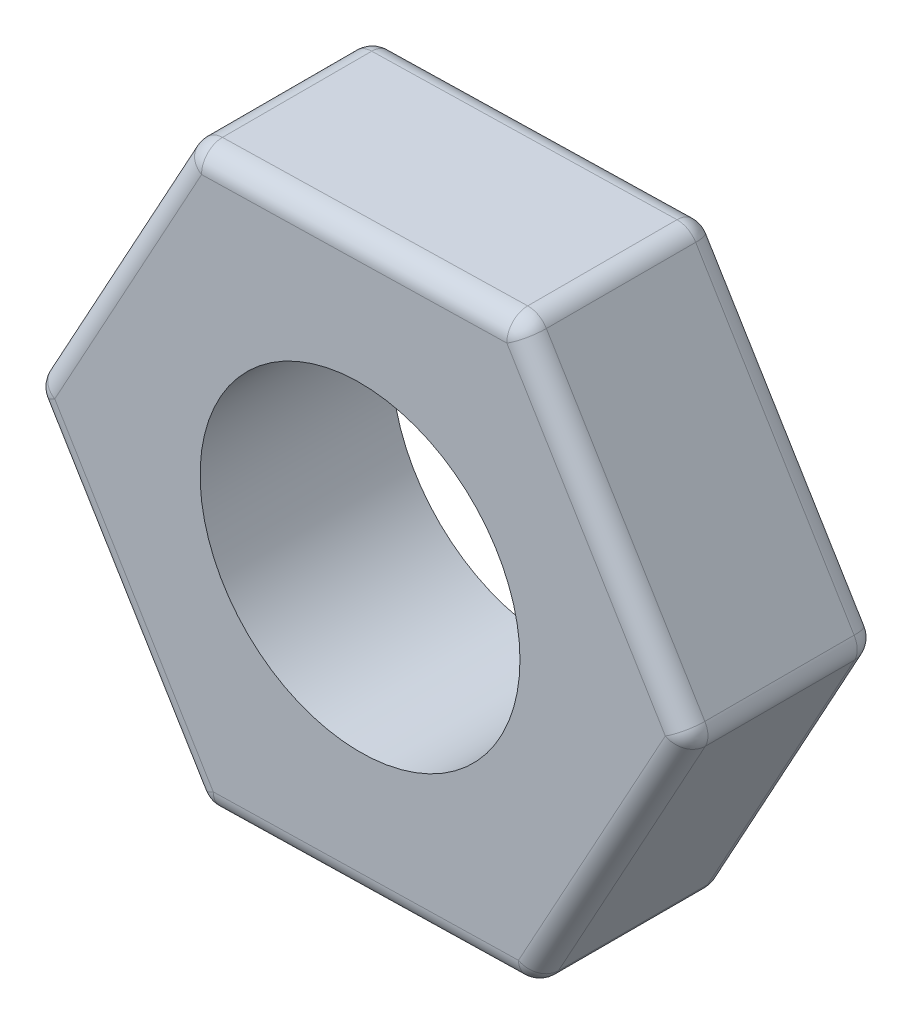
ISO-10303-21;
HEADER;
FILE_DESCRIPTION(('STEP AP214'),'2;1');
FILE_NAME('part.step','',(''),(''),'','','');
FILE_SCHEMA(('AUTOMOTIVE_DESIGN { 1 0 10303 214 1 1 1 1 }'));
ENDSEC;
DATA;
#1=APPLICATION_CONTEXT('core data for automotive mechanical design processes');
#2=APPLICATION_PROTOCOL_DEFINITION('international standard','automotive_design',2000,#1);
#3=PRODUCT_CONTEXT('',#1,'mechanical');
#4=PRODUCT('Part','Part','',(#3));
#5=PRODUCT_RELATED_PRODUCT_CATEGORY('part','',(#4));
#6=PRODUCT_DEFINITION_FORMATION('','',#4);
#7=PRODUCT_DEFINITION_CONTEXT('part definition',#1,'design');
#8=PRODUCT_DEFINITION('design','',#6,#7);
#9=PRODUCT_DEFINITION_SHAPE('','',#8);
#10=(LENGTH_UNIT() NAMED_UNIT(*) SI_UNIT(.MILLI.,.METRE.));
#11=(NAMED_UNIT(*) PLANE_ANGLE_UNIT() SI_UNIT($,.RADIAN.));
#12=(NAMED_UNIT(*) SI_UNIT($,.STERADIAN.) SOLID_ANGLE_UNIT());
#13=UNCERTAINTY_MEASURE_WITH_UNIT(LENGTH_MEASURE(1.E-05),#10,'distance_accuracy_value','');
#14=(GEOMETRIC_REPRESENTATION_CONTEXT(3) GLOBAL_UNCERTAINTY_ASSIGNED_CONTEXT((#13)) GLOBAL_UNIT_ASSIGNED_CONTEXT((#10,
#11,#12)) REPRESENTATION_CONTEXT('',''));
#15=CARTESIAN_POINT('',(0.,0.,0.));
#16=DIRECTION('',(0.,0.,1.));
#17=DIRECTION('',(1.,0.,0.));
#18=AXIS2_PLACEMENT_3D('',#15,#16,#17);
#19=CARTESIAN_POINT('',(0.,0.,1.8));
#20=DIRECTION('',(0.,0.,1.));
#21=DIRECTION('',(1.,0.,0.));
#22=AXIS2_PLACEMENT_3D('',#19,#20,#21);
#23=PLANE('',#22);
#24=DIRECTION('',(-0.480832611206843,-0.876812408671324,0.));
#25=VECTOR('',#24,1.);
#26=CARTESIAN_POINT('',(-2.91848645804621,-0.164225843076547,1.8));
#27=LINE('',#26,#25);
#28=CARTESIAN_POINT('',(-1.48602485646664,2.44791001862745,1.8));
#29=VERTEX_POINT('',#28);
#30=CARTESIAN_POINT('',(-2.86296469054313,-0.0629802670415083,1.8));
#31=VERTEX_POINT('',#30);
#32=EDGE_CURVE('E296',#29,#31,#27,.T.);
#33=ORIENTED_EDGE('',*,*,#32,.T.);
#34=DIRECTION('',(0.518925514659368,-0.854819460608794,0.));
#35=VECTOR('',#34,1.);
#36=CARTESIAN_POINT('',(-1.3170194769609,-2.60959633480716,1.8));
#37=LINE('',#36,#35);
#38=CARTESIAN_POINT('',(-1.37693983407649,-2.51089028566896,1.8));
#39=VERTEX_POINT('',#38);
#40=EDGE_CURVE('E11',#31,#39,#37,.T.);
#41=ORIENTED_EDGE('',*,*,#40,.T.);
#42=DIRECTION('',(0.999758125866211,0.0219929480625294,0.));
#43=VECTOR('',#42,1.);
#44=CARTESIAN_POINT('',(1.60146698108531,-2.44537049173062,1.8));
#45=LINE('',#44,#43);
#46=CARTESIAN_POINT('',(1.48602485646664,-2.44791001862745,1.8));
#47=VERTEX_POINT('',#46);
#48=EDGE_CURVE('E49',#39,#47,#45,.T.);
#49=ORIENTED_EDGE('',*,*,#48,.T.);
#50=DIRECTION('',(0.480832611206843,0.876812408671324,0.));
#51=VECTOR('',#50,1.);
#52=CARTESIAN_POINT('',(2.91848645804621,0.164225843076547,1.8));
#53=LINE('',#52,#51);
#54=CARTESIAN_POINT('',(2.86296469054313,0.0629802670415073,1.8));
#55=VERTEX_POINT('',#54);
#56=EDGE_CURVE('E305',#47,#55,#53,.T.);
#57=ORIENTED_EDGE('',*,*,#56,.T.);
#58=DIRECTION('',(-0.518925514659368,0.854819460608794,0.));
#59=VECTOR('',#58,1.);
#60=CARTESIAN_POINT('',(1.3170194769609,2.60959633480716,1.8));
#61=LINE('',#60,#59);
#62=CARTESIAN_POINT('',(1.37693983407649,2.51089028566896,1.8));
#63=VERTEX_POINT('',#62);
#64=EDGE_CURVE('E302',#55,#63,#61,.T.);
#65=ORIENTED_EDGE('',*,*,#64,.T.);
#66=DIRECTION('',(-0.999758125866211,-0.0219929480625296,0.));
#67=VECTOR('',#66,1.);
#68=CARTESIAN_POINT('',(-1.60146698108531,2.44537049173062,1.8));
#69=LINE('',#68,#67);
#70=EDGE_CURVE('E299',#63,#29,#69,.T.);
#71=ORIENTED_EDGE('',*,*,#70,.T.);
#72=EDGE_LOOP('',(#33,#41,#49,#57,#65,#71));
#73=FACE_BOUND('',#72,.T.);
#74=CARTESIAN_POINT('',(0.,0.,1.8));
#75=DIRECTION('',(0.,0.,1.));
#76=DIRECTION('',(1.,0.,0.));
#77=AXIS2_PLACEMENT_3D('',#74,#75,#76);
#78=CIRCLE('',#77,1.5);
#79=CARTESIAN_POINT('',(1.5,0.,1.8));
#80=VERTEX_POINT('',#79);
#81=EDGE_CURVE('E201',#80,#80,#78,.T.);
#82=ORIENTED_EDGE('',*,*,#81,.F.);
#83=EDGE_LOOP('',(#82));
#84=FACE_BOUND('',#83,.T.);
#85=ADVANCED_FACE('F39',(#73,#84),#23,.T.);
#86=CARTESIAN_POINT('',(0.,0.,0.));
#87=DIRECTION('',(0.,0.,1.));
#88=DIRECTION('',(1.,0.,0.));
#89=AXIS2_PLACEMENT_3D('',#86,#87,#88);
#90=PLANE('',#89);
#91=DIRECTION('',(-0.480832611206843,-0.876812408671324,0.));
#92=VECTOR('',#91,1.);
#93=CARTESIAN_POINT('',(-2.17449477350488,1.19246487579297,0.));
#94=LINE('',#93,#92);
#95=CARTESIAN_POINT('',(-2.86296469054313,-0.062980267041508,0.));
#96=VERTEX_POINT('',#95);
#97=CARTESIAN_POINT('',(-1.48602485646664,2.44791001862745,0.));
#98=VERTEX_POINT('',#97);
#99=EDGE_CURVE('E211',#96,#98,#94,.F.);
#100=ORIENTED_EDGE('',*,*,#99,.T.);
#101=DIRECTION('',(-0.999758125866211,-0.0219929480625296,0.));
#102=VECTOR('',#101,1.);
#103=CARTESIAN_POINT('',(-0.0545425111950734,2.4794001521482,0.));
#104=LINE('',#103,#102);
#105=CARTESIAN_POINT('',(1.37693983407649,2.51089028566896,0.));
#106=VERTEX_POINT('',#105);
#107=EDGE_CURVE('E175',#98,#106,#104,.F.);
#108=ORIENTED_EDGE('',*,*,#107,.T.);
#109=DIRECTION('',(-0.518925514659368,0.854819460608794,0.));
#110=VECTOR('',#109,1.);
#111=CARTESIAN_POINT('',(2.11995226230981,1.28693527635523,0.));
#112=LINE('',#111,#110);
#113=CARTESIAN_POINT('',(2.86296469054313,0.0629802670415077,0.));
#114=VERTEX_POINT('',#113);
#115=EDGE_CURVE('E226',#106,#114,#112,.F.);
#116=ORIENTED_EDGE('',*,*,#115,.T.);
#117=DIRECTION('',(0.480832611206843,0.876812408671324,0.));
#118=VECTOR('',#117,1.);
#119=CARTESIAN_POINT('',(2.17449477350488,-1.19246487579297,0.));
#120=LINE('',#119,#118);
#121=CARTESIAN_POINT('',(1.48602485646664,-2.44791001862745,0.));
#122=VERTEX_POINT('',#121);
#123=EDGE_CURVE('E223',#114,#122,#120,.F.);
#124=ORIENTED_EDGE('',*,*,#123,.T.);
#125=DIRECTION('',(0.999758125866211,0.0219929480625294,0.));
#126=VECTOR('',#125,1.);
#127=CARTESIAN_POINT('',(0.054542511195073,-2.47940015214821,0.));
#128=LINE('',#127,#126);
#129=CARTESIAN_POINT('',(-1.37693983407649,-2.51089028566896,0.));
#130=VERTEX_POINT('',#129);
#131=EDGE_CURVE('E220',#122,#130,#128,.F.);
#132=ORIENTED_EDGE('',*,*,#131,.T.);
#133=DIRECTION('',(0.518925514659368,-0.854819460608794,0.));
#134=VECTOR('',#133,1.);
#135=CARTESIAN_POINT('',(-2.11995226230981,-1.28693527635523,0.));
#136=LINE('',#135,#134);
#137=EDGE_CURVE('E217',#130,#96,#136,.F.);
#138=ORIENTED_EDGE('',*,*,#137,.T.);
#139=EDGE_LOOP('',(#100,#108,#116,#124,#132,#138));
#140=FACE_BOUND('',#139,.T.);
#141=CARTESIAN_POINT('',(0.,0.,0.));
#142=DIRECTION('',(0.,0.,1.));
#143=DIRECTION('',(1.,0.,0.));
#144=AXIS2_PLACEMENT_3D('',#141,#142,#143);
#145=CIRCLE('',#144,1.5);
#146=CARTESIAN_POINT('',(1.5,0.,0.));
#147=VERTEX_POINT('',#146);
#148=EDGE_CURVE('E430',#147,#147,#145,.T.);
#149=ORIENTED_EDGE('',*,*,#148,.T.);
#150=EDGE_LOOP('',(#149));
#151=FACE_BOUND('',#150,.T.);
#152=ADVANCED_FACE('F448',(#140,#151),#90,.F.);
#153=CARTESIAN_POINT('',(-3.09384893978048,-0.0680593208351778,1.8));
#154=DIRECTION('',(0.854819460608794,0.518925514659368,0.));
#155=DIRECTION('',(-0.518925514659368,0.854819460608794,0.));
#156=AXIS2_PLACEMENT_3D('',#153,#154,#155);
#157=PLANE('',#156);
#158=DIRECTION('',(0.518925514659368,-0.854819460608794,0.));
#159=VECTOR('',#158,1.);
#160=CARTESIAN_POINT('',(-3.09384893978048,-0.0680593208351778,0.2));
#161=LINE('',#160,#159);
#162=CARTESIAN_POINT('',(-3.03392858266489,-0.166765369973382,0.2));
#163=VERTEX_POINT('',#162);
#164=CARTESIAN_POINT('',(-1.54790372619825,-2.61467538860083,0.2));
#165=VERTEX_POINT('',#164);
#166=EDGE_CURVE('E276',#163,#165,#161,.T.);
#167=ORIENTED_EDGE('',*,*,#166,.T.);
#168=DIRECTION('',(0.,0.,-1.));
#169=VECTOR('',#168,1.);
#170=CARTESIAN_POINT('',(-1.54790372619825,-2.61467538860083,1.8));
#171=LINE('',#170,#169);
#172=CARTESIAN_POINT('',(-1.54790372619825,-2.61467538860083,1.6));
#173=VERTEX_POINT('',#172);
#174=EDGE_CURVE('E280',#165,#173,#171,.F.);
#175=ORIENTED_EDGE('',*,*,#174,.T.);
#176=DIRECTION('',(0.518925514659368,-0.854819460608794,0.));
#177=VECTOR('',#176,1.);
#178=CARTESIAN_POINT('',(-3.09384893978048,-0.0680593208351775,1.6));
#179=LINE('',#178,#177);
#180=CARTESIAN_POINT('',(-3.03392858266489,-0.166765369973382,1.6));
#181=VERTEX_POINT('',#180);
#182=EDGE_CURVE('E273',#173,#181,#179,.F.);
#183=ORIENTED_EDGE('',*,*,#182,.T.);
#184=DIRECTION('',(0.,0.,-1.));
#185=VECTOR('',#184,1.);
#186=CARTESIAN_POINT('',(-3.03392858266489,-0.166765369973382,1.8));
#187=LINE('',#186,#185);
#188=EDGE_CURVE('E270',#181,#163,#187,.T.);
#189=ORIENTED_EDGE('',*,*,#188,.T.);
#190=EDGE_LOOP('',(#167,#175,#183,#189));
#191=FACE_BOUND('',#190,.T.);
#192=ADVANCED_FACE('F453',(#191),#157,.F.);
#193=CARTESIAN_POINT('',(-1.48798336908266,-2.71338143773904,1.8));
#194=DIRECTION('',(-0.0219929480625294,0.999758125866211,0.));
#195=DIRECTION('',(-0.999758125866211,-0.0219929480625294,0.));
#196=AXIS2_PLACEMENT_3D('',#193,#194,#195);
#197=PLANE('',#196);
#198=DIRECTION('',(0.999758125866211,0.0219929480625294,0.));
#199=VECTOR('',#198,1.);
#200=CARTESIAN_POINT('',(-1.48798336908266,-2.71338143773904,1.6));
#201=LINE('',#200,#199);
#202=CARTESIAN_POINT('',(1.49042344607914,-2.64786164380069,1.6));
#203=VERTEX_POINT('',#202);
#204=CARTESIAN_POINT('',(-1.37254124446399,-2.7108419108422,1.6));
#205=VERTEX_POINT('',#204);
#206=EDGE_CURVE('E260',#203,#205,#201,.F.);
#207=ORIENTED_EDGE('',*,*,#206,.T.);
#208=DIRECTION('',(0.,0.,-1.));
#209=VECTOR('',#208,1.);
#210=CARTESIAN_POINT('',(-1.37254124446399,-2.7108419108422,1.8));
#211=LINE('',#210,#209);
#212=CARTESIAN_POINT('',(-1.37254124446399,-2.7108419108422,0.2));
#213=VERTEX_POINT('',#212);
#214=EDGE_CURVE('E267',#205,#213,#211,.T.);
#215=ORIENTED_EDGE('',*,*,#214,.T.);
#216=DIRECTION('',(0.999758125866211,0.0219929480625294,0.));
#217=VECTOR('',#216,1.);
#218=CARTESIAN_POINT('',(-1.48798336908266,-2.71338143773904,0.2));
#219=LINE('',#218,#217);
#220=CARTESIAN_POINT('',(1.49042344607914,-2.64786164380069,0.2));
#221=VERTEX_POINT('',#220);
#222=EDGE_CURVE('E263',#213,#221,#219,.T.);
#223=ORIENTED_EDGE('',*,*,#222,.T.);
#224=DIRECTION('',(0.,0.,-1.));
#225=VECTOR('',#224,1.);
#226=CARTESIAN_POINT('',(1.49042344607914,-2.64786164380069,1.8));
#227=LINE('',#226,#225);
#228=EDGE_CURVE('E257',#221,#203,#227,.F.);
#229=ORIENTED_EDGE('',*,*,#228,.T.);
#230=EDGE_LOOP('',(#207,#215,#223,#229));
#231=FACE_BOUND('',#230,.T.);
#232=ADVANCED_FACE('F471',(#231),#197,.F.);
#233=CARTESIAN_POINT('',(1.60586557069782,-2.64532211690386,1.8));
#234=DIRECTION('',(-0.876812408671324,0.480832611206843,0.));
#235=DIRECTION('',(-0.480832611206843,-0.876812408671324,0.));
#236=AXIS2_PLACEMENT_3D('',#233,#234,#235);
#237=PLANE('',#236);
#238=DIRECTION('',(0.480832611206843,0.876812408671324,0.));
#239=VECTOR('',#238,1.);
#240=CARTESIAN_POINT('',(1.60586557069782,-2.64532211690386,1.6));
#241=LINE('',#240,#239);
#242=CARTESIAN_POINT('',(3.03832717227739,-0.0331862551998609,1.6));
#243=VERTEX_POINT('',#242);
#244=CARTESIAN_POINT('',(1.6613873382009,-2.54407654086882,1.6));
#245=VERTEX_POINT('',#244);
#246=EDGE_CURVE('E247',#243,#245,#241,.F.);
#247=ORIENTED_EDGE('',*,*,#246,.T.);
#248=DIRECTION('',(0.,0.,-1.));
#249=VECTOR('',#248,1.);
#250=CARTESIAN_POINT('',(1.6613873382009,-2.54407654086882,1.8));
#251=LINE('',#250,#249);
#252=CARTESIAN_POINT('',(1.6613873382009,-2.54407654086882,0.2));
#253=VERTEX_POINT('',#252);
#254=EDGE_CURVE('E254',#245,#253,#251,.T.);
#255=ORIENTED_EDGE('',*,*,#254,.T.);
#256=DIRECTION('',(0.480832611206843,0.876812408671324,0.));
#257=VECTOR('',#256,1.);
#258=CARTESIAN_POINT('',(1.60586557069782,-2.64532211690386,0.2));
#259=LINE('',#258,#257);
#260=CARTESIAN_POINT('',(3.03832717227739,-0.0331862551998609,0.2));
#261=VERTEX_POINT('',#260);
#262=EDGE_CURVE('E250',#253,#261,#259,.T.);
#263=ORIENTED_EDGE('',*,*,#262,.T.);
#264=DIRECTION('',(0.,0.,-1.));
#265=VECTOR('',#264,1.);
#266=CARTESIAN_POINT('',(3.03832717227739,-0.0331862551998605,1.8));
#267=LINE('',#266,#265);
#268=EDGE_CURVE('E244',#261,#243,#267,.F.);
#269=ORIENTED_EDGE('',*,*,#268,.T.);
#270=EDGE_LOOP('',(#247,#255,#263,#269));
#271=FACE_BOUND('',#270,.T.);
#272=ADVANCED_FACE('F467',(#271),#237,.F.);
#273=CARTESIAN_POINT('',(3.09384893978048,0.0680593208351781,1.8));
#274=DIRECTION('',(-0.854819460608794,-0.518925514659368,0.));
#275=DIRECTION('',(0.518925514659368,-0.854819460608794,0.));
#276=AXIS2_PLACEMENT_3D('',#273,#274,#275);
#277=PLANE('',#276);
#278=DIRECTION('',(-0.518925514659368,0.854819460608794,0.));
#279=VECTOR('',#278,1.);
#280=CARTESIAN_POINT('',(3.09384893978048,0.0680593208351781,1.6));
#281=LINE('',#280,#279);
#282=CARTESIAN_POINT('',(1.54790372619825,2.61467538860083,1.6));
#283=VERTEX_POINT('',#282);
#284=CARTESIAN_POINT('',(3.03392858266489,0.166765369973382,1.6));
#285=VERTEX_POINT('',#284);
#286=EDGE_CURVE('E234',#283,#285,#281,.F.);
#287=ORIENTED_EDGE('',*,*,#286,.T.);
#288=DIRECTION('',(0.,0.,-1.));
#289=VECTOR('',#288,1.);
#290=CARTESIAN_POINT('',(3.03392858266489,0.166765369973382,1.8));
#291=LINE('',#290,#289);
#292=CARTESIAN_POINT('',(3.03392858266489,0.166765369973382,0.2));
#293=VERTEX_POINT('',#292);
#294=EDGE_CURVE('E241',#285,#293,#291,.T.);
#295=ORIENTED_EDGE('',*,*,#294,.T.);
#296=DIRECTION('',(-0.518925514659368,0.854819460608794,0.));
#297=VECTOR('',#296,1.);
#298=CARTESIAN_POINT('',(3.09384893978048,0.0680593208351781,0.2));
#299=LINE('',#298,#297);
#300=CARTESIAN_POINT('',(1.54790372619825,2.61467538860083,0.2));
#301=VERTEX_POINT('',#300);
#302=EDGE_CURVE('E237',#293,#301,#299,.T.);
#303=ORIENTED_EDGE('',*,*,#302,.T.);
#304=DIRECTION('',(0.,0.,-1.));
#305=VECTOR('',#304,1.);
#306=CARTESIAN_POINT('',(1.54790372619825,2.61467538860083,1.8));
#307=LINE('',#306,#305);
#308=EDGE_CURVE('E231',#301,#283,#307,.F.);
#309=ORIENTED_EDGE('',*,*,#308,.T.);
#310=EDGE_LOOP('',(#287,#295,#303,#309));
#311=FACE_BOUND('',#310,.T.);
#312=ADVANCED_FACE('F464',(#311),#277,.F.);
#313=CARTESIAN_POINT('',(1.48798336908266,2.71338143773904,1.8));
#314=DIRECTION('',(0.0219929480625296,-0.999758125866211,0.));
#315=DIRECTION('',(0.999758125866211,0.0219929480625296,0.));
#316=AXIS2_PLACEMENT_3D('',#313,#314,#315);
#317=PLANE('',#316);
#318=DIRECTION('',(-0.999758125866211,-0.0219929480625296,0.));
#319=VECTOR('',#318,1.);
#320=CARTESIAN_POINT('',(1.48798336908266,2.71338143773904,1.6));
#321=LINE('',#320,#319);
#322=CARTESIAN_POINT('',(-1.49042344607914,2.64786164380069,1.6));
#323=VERTEX_POINT('',#322);
#324=CARTESIAN_POINT('',(1.37254124446398,2.7108419108422,1.6));
#325=VERTEX_POINT('',#324);
#326=EDGE_CURVE('E200',#323,#325,#321,.F.);
#327=ORIENTED_EDGE('',*,*,#326,.T.);
#328=DIRECTION('',(0.,0.,-1.));
#329=VECTOR('',#328,1.);
#330=CARTESIAN_POINT('',(1.37254124446398,2.7108419108422,1.8));
#331=LINE('',#330,#329);
#332=CARTESIAN_POINT('',(1.37254124446398,2.7108419108422,0.2));
#333=VERTEX_POINT('',#332);
#334=EDGE_CURVE('E205',#325,#333,#331,.T.);
#335=ORIENTED_EDGE('',*,*,#334,.T.);
#336=DIRECTION('',(-0.999758125866211,-0.0219929480625296,0.));
#337=VECTOR('',#336,1.);
#338=CARTESIAN_POINT('',(1.48798336908266,2.71338143773904,0.2));
#339=LINE('',#338,#337);
#340=CARTESIAN_POINT('',(-1.49042344607914,2.64786164380069,0.2));
#341=VERTEX_POINT('',#340);
#342=EDGE_CURVE('E173',#333,#341,#339,.T.);
#343=ORIENTED_EDGE('',*,*,#342,.T.);
#344=DIRECTION('',(0.,0.,-1.));
#345=VECTOR('',#344,1.);
#346=CARTESIAN_POINT('',(-1.49042344607914,2.64786164380069,1.8));
#347=LINE('',#346,#345);
#348=EDGE_CURVE('E193',#341,#323,#347,.F.);
#349=ORIENTED_EDGE('',*,*,#348,.T.);
#350=EDGE_LOOP('',(#327,#335,#343,#349));
#351=FACE_BOUND('',#350,.T.);
#352=ADVANCED_FACE('F203',(#351),#317,.F.);
#353=CARTESIAN_POINT('',(-1.60586557069782,2.64532211690386,1.8));
#354=DIRECTION('',(0.876812408671324,-0.480832611206843,0.));
#355=DIRECTION('',(0.480832611206843,0.876812408671324,0.));
#356=AXIS2_PLACEMENT_3D('',#353,#354,#355);
#357=PLANE('',#356);
#358=DIRECTION('',(-0.480832611206843,-0.876812408671324,0.));
#359=VECTOR('',#358,1.);
#360=CARTESIAN_POINT('',(-1.60586557069782,2.64532211690386,0.2));
#361=LINE('',#360,#359);
#362=CARTESIAN_POINT('',(-1.6613873382009,2.54407654086882,0.2));
#363=VERTEX_POINT('',#362);
#364=CARTESIAN_POINT('',(-3.03832717227739,0.033186255199861,0.2));
#365=VERTEX_POINT('',#364);
#366=EDGE_CURVE('E289',#363,#365,#361,.T.);
#367=ORIENTED_EDGE('',*,*,#366,.T.);
#368=DIRECTION('',(0.,0.,-1.));
#369=VECTOR('',#368,1.);
#370=CARTESIAN_POINT('',(-3.03832717227739,0.033186255199861,1.8));
#371=LINE('',#370,#369);
#372=CARTESIAN_POINT('',(-3.03832717227739,0.033186255199861,1.6));
#373=VERTEX_POINT('',#372);
#374=EDGE_CURVE('E293',#365,#373,#371,.F.);
#375=ORIENTED_EDGE('',*,*,#374,.T.);
#376=DIRECTION('',(-0.480832611206843,-0.876812408671324,0.));
#377=VECTOR('',#376,1.);
#378=CARTESIAN_POINT('',(-1.60586557069782,2.64532211690386,1.6));
#379=LINE('',#378,#377);
#380=CARTESIAN_POINT('',(-1.6613873382009,2.54407654086882,1.6));
#381=VERTEX_POINT('',#380);
#382=EDGE_CURVE('E286',#373,#381,#379,.F.);
#383=ORIENTED_EDGE('',*,*,#382,.T.);
#384=DIRECTION('',(0.,0.,-1.));
#385=VECTOR('',#384,1.);
#386=CARTESIAN_POINT('',(-1.6613873382009,2.54407654086882,1.8));
#387=LINE('',#386,#385);
#388=EDGE_CURVE('E283',#381,#363,#387,.T.);
#389=ORIENTED_EDGE('',*,*,#388,.T.);
#390=EDGE_LOOP('',(#367,#375,#383,#389));
#391=FACE_BOUND('',#390,.T.);
#392=ADVANCED_FACE('F458',(#391),#357,.F.);
#393=CARTESIAN_POINT('',(0.,0.,1.8));
#394=DIRECTION('',(0.,0.,-1.));
#395=DIRECTION('',(-1.,0.,0.));
#396=AXIS2_PLACEMENT_3D('',#393,#394,#395);
#397=CYLINDRICAL_SURFACE('',#396,1.5);
#398=ORIENTED_EDGE('',*,*,#81,.T.);
#399=EDGE_LOOP('',(#398));
#400=FACE_BOUND('',#399,.T.);
#401=ORIENTED_EDGE('',*,*,#148,.F.);
#402=EDGE_LOOP('',(#401));
#403=FACE_BOUND('',#402,.T.);
#404=ADVANCED_FACE('F444',(#400,#403),#397,.F.);
#405=CARTESIAN_POINT('',(0.054542511195073,-2.47940015214821,1.6));
#406=DIRECTION('',(-0.999758125866211,-0.0219929480625294,0.));
#407=DIRECTION('',(0.0219929480625294,-0.999758125866211,0.));
#408=AXIS2_PLACEMENT_3D('',#405,#406,#407);
#409=CYLINDRICAL_SURFACE('',#408,0.2);
#410=CARTESIAN_POINT('',(1.48602485646664,-2.44791001862745,1.6));
#411=DIRECTION('',(0.999758125866211,0.0219929480625291,0.));
#412=DIRECTION('',(-0.0219929480625291,0.999758125866211,0.));
#413=AXIS2_PLACEMENT_3D('',#410,#411,#412);
#414=CIRCLE('',#413,0.2);
#415=EDGE_CURVE('E43',#47,#203,#414,.T.);
#416=ORIENTED_EDGE('',*,*,#415,.F.);
#417=ORIENTED_EDGE('',*,*,#48,.F.);
#418=CARTESIAN_POINT('',(-1.37693983407649,-2.51089028566896,1.6));
#419=DIRECTION('',(-0.999758125866211,-0.021992948062529,0.));
#420=DIRECTION('',(0.021992948062529,-0.999758125866211,0.));
#421=AXIS2_PLACEMENT_3D('',#418,#419,#420);
#422=CIRCLE('',#421,0.2);
#423=EDGE_CURVE('E423',#205,#39,#422,.T.);
#424=ORIENTED_EDGE('',*,*,#423,.F.);
#425=ORIENTED_EDGE('',*,*,#206,.F.);
#426=EDGE_LOOP('',(#416,#417,#424,#425));
#427=FACE_BOUND('',#426,.T.);
#428=ADVANCED_FACE('F41',(#427),#409,.T.);
#429=CARTESIAN_POINT('',(1.48602485646664,-2.44791001862745,1.6));
#430=DIRECTION('',(0.,0.,1.));
#431=DIRECTION('',(1.,0.,0.));
#432=AXIS2_PLACEMENT_3D('',#429,#430,#431);
#433=SPHERICAL_SURFACE('',#432,0.2);
#434=CARTESIAN_POINT('',(1.48602485646664,-2.44791001862745,1.6));
#435=DIRECTION('',(-0.480832611206843,-0.876812408671324,0.));
#436=DIRECTION('',(0.876812408671324,-0.480832611206843,0.));
#437=AXIS2_PLACEMENT_3D('',#434,#435,#436);
#438=CIRCLE('',#437,0.2);
#439=EDGE_CURVE('E416',#47,#245,#438,.F.);
#440=ORIENTED_EDGE('',*,*,#439,.F.);
#441=ORIENTED_EDGE('',*,*,#415,.T.);
#442=CARTESIAN_POINT('',(1.48602485646664,-2.44791001862745,1.6));
#443=DIRECTION('',(0.,0.,1.));
#444=DIRECTION('',(1.,0.,0.));
#445=AXIS2_PLACEMENT_3D('',#442,#443,#444);
#446=CIRCLE('',#445,0.2);
#447=EDGE_CURVE('E420',#245,#203,#446,.F.);
#448=ORIENTED_EDGE('',*,*,#447,.F.);
#449=EDGE_LOOP('',(#440,#441,#448));
#450=FACE_BOUND('',#449,.T.);
#451=ADVANCED_FACE('F582',(#450),#433,.T.);
#452=CARTESIAN_POINT('',(-1.37693983407649,-2.51089028566896,1.6));
#453=DIRECTION('',(0.,0.,1.));
#454=DIRECTION('',(1.,0.,0.));
#455=AXIS2_PLACEMENT_3D('',#452,#453,#454);
#456=SPHERICAL_SURFACE('',#455,0.2);
#457=CARTESIAN_POINT('',(-1.37693983407649,-2.51089028566896,1.6));
#458=DIRECTION('',(0.,0.,1.));
#459=DIRECTION('',(1.,0.,0.));
#460=AXIS2_PLACEMENT_3D('',#457,#458,#459);
#461=CIRCLE('',#460,0.2);
#462=EDGE_CURVE('E410',#205,#173,#461,.F.);
#463=ORIENTED_EDGE('',*,*,#462,.F.);
#464=ORIENTED_EDGE('',*,*,#423,.T.);
#465=CARTESIAN_POINT('',(-1.37693983407649,-2.51089028566896,1.6));
#466=DIRECTION('',(0.518925514659368,-0.854819460608794,0.));
#467=DIRECTION('',(0.854819460608795,0.518925514659368,0.));
#468=AXIS2_PLACEMENT_3D('',#465,#466,#467);
#469=CIRCLE('',#468,0.2);
#470=EDGE_CURVE('E57',#173,#39,#469,.F.);
#471=ORIENTED_EDGE('',*,*,#470,.F.);
#472=EDGE_LOOP('',(#463,#464,#471));
#473=FACE_BOUND('',#472,.T.);
#474=ADVANCED_FACE('F579',(#473),#456,.T.);
#475=CARTESIAN_POINT('',(1.48602485646664,-2.44791001862745,1.8));
#476=DIRECTION('',(0.,0.,-1.));
#477=DIRECTION('',(-1.,0.,0.));
#478=AXIS2_PLACEMENT_3D('',#475,#476,#477);
#479=CYLINDRICAL_SURFACE('',#478,0.2);
#480=ORIENTED_EDGE('',*,*,#447,.T.);
#481=ORIENTED_EDGE('',*,*,#228,.F.);
#482=CARTESIAN_POINT('',(1.48602485646664,-2.44791001862745,0.2));
#483=DIRECTION('',(0.,0.,-1.));
#484=DIRECTION('',(-1.,0.,0.));
#485=AXIS2_PLACEMENT_3D('',#482,#483,#484);
#486=CIRCLE('',#485,0.2);
#487=EDGE_CURVE('E403',#253,#221,#486,.T.);
#488=ORIENTED_EDGE('',*,*,#487,.F.);
#489=ORIENTED_EDGE('',*,*,#254,.F.);
#490=EDGE_LOOP('',(#480,#481,#488,#489));
#491=FACE_BOUND('',#490,.T.);
#492=ADVANCED_FACE('F575',(#491),#479,.T.);
#493=CARTESIAN_POINT('',(2.17449477350488,-1.19246487579297,1.6));
#494=DIRECTION('',(-0.480832611206843,-0.876812408671324,0.));
#495=DIRECTION('',(0.876812408671324,-0.480832611206843,0.));
#496=AXIS2_PLACEMENT_3D('',#493,#494,#495);
#497=CYLINDRICAL_SURFACE('',#496,0.2);
#498=ORIENTED_EDGE('',*,*,#439,.T.);
#499=ORIENTED_EDGE('',*,*,#246,.F.);
#500=CARTESIAN_POINT('',(2.86296469054313,0.0629802670415073,1.6));
#501=DIRECTION('',(0.480832611206842,0.876812408671325,0.));
#502=DIRECTION('',(-0.876812408671325,0.480832611206842,0.));
#503=AXIS2_PLACEMENT_3D('',#500,#501,#502);
#504=CIRCLE('',#503,0.2);
#505=EDGE_CURVE('E399',#55,#243,#504,.T.);
#506=ORIENTED_EDGE('',*,*,#505,.F.);
#507=ORIENTED_EDGE('',*,*,#56,.F.);
#508=EDGE_LOOP('',(#498,#499,#506,#507));
#509=FACE_BOUND('',#508,.T.);
#510=ADVANCED_FACE('F572',(#509),#497,.T.);
#511=CARTESIAN_POINT('',(-2.11995226230981,-1.28693527635523,1.6));
#512=DIRECTION('',(-0.518925514659368,0.854819460608794,0.));
#513=DIRECTION('',(-0.854819460608794,-0.518925514659368,0.));
#514=AXIS2_PLACEMENT_3D('',#511,#512,#513);
#515=CYLINDRICAL_SURFACE('',#514,0.2);
#516=ORIENTED_EDGE('',*,*,#470,.T.);
#517=ORIENTED_EDGE('',*,*,#40,.F.);
#518=CARTESIAN_POINT('',(-2.86296469054313,-0.0629802670415079,1.6));
#519=DIRECTION('',(-0.518925514659368,0.854819460608794,0.));
#520=DIRECTION('',(-0.854819460608795,-0.518925514659368,0.));
#521=AXIS2_PLACEMENT_3D('',#518,#519,#520);
#522=CIRCLE('',#521,0.2);
#523=EDGE_CURVE('E395',#181,#31,#522,.T.);
#524=ORIENTED_EDGE('',*,*,#523,.F.);
#525=ORIENTED_EDGE('',*,*,#182,.F.);
#526=EDGE_LOOP('',(#516,#517,#524,#525));
#527=FACE_BOUND('',#526,.T.);
#528=ADVANCED_FACE('F568',(#527),#515,.T.);
#529=CARTESIAN_POINT('',(-1.37693983407649,-2.51089028566896,1.8));
#530=DIRECTION('',(0.,0.,-1.));
#531=DIRECTION('',(-1.,0.,0.));
#532=AXIS2_PLACEMENT_3D('',#529,#530,#531);
#533=CYLINDRICAL_SURFACE('',#532,0.2);
#534=ORIENTED_EDGE('',*,*,#462,.T.);
#535=ORIENTED_EDGE('',*,*,#174,.F.);
#536=CARTESIAN_POINT('',(-1.37693983407649,-2.51089028566896,0.2));
#537=DIRECTION('',(0.,0.,-1.));
#538=DIRECTION('',(-1.,0.,0.));
#539=AXIS2_PLACEMENT_3D('',#536,#537,#538);
#540=CIRCLE('',#539,0.2);
#541=EDGE_CURVE('E391',#213,#165,#540,.T.);
#542=ORIENTED_EDGE('',*,*,#541,.F.);
#543=ORIENTED_EDGE('',*,*,#214,.F.);
#544=EDGE_LOOP('',(#534,#535,#542,#543));
#545=FACE_BOUND('',#544,.T.);
#546=ADVANCED_FACE('F564',(#545),#533,.T.);
#547=CARTESIAN_POINT('',(-1.49238195869517,-2.51342981256579,0.2));
#548=DIRECTION('',(0.999758125866211,0.0219929480625294,0.));
#549=DIRECTION('',(-0.0219929480625294,0.999758125866211,0.));
#550=AXIS2_PLACEMENT_3D('',#547,#548,#549);
#551=CYLINDRICAL_SURFACE('',#550,0.2);
#552=CARTESIAN_POINT('',(1.48602485646664,-2.44791001862745,0.2));
#553=DIRECTION('',(0.999758125866211,0.0219929480625291,0.));
#554=DIRECTION('',(-0.0219929480625291,0.999758125866211,0.));
#555=AXIS2_PLACEMENT_3D('',#552,#553,#554);
#556=CIRCLE('',#555,0.2);
#557=EDGE_CURVE('E406',#221,#122,#556,.T.);
#558=ORIENTED_EDGE('',*,*,#557,.F.);
#559=ORIENTED_EDGE('',*,*,#222,.F.);
#560=CARTESIAN_POINT('',(-1.37693983407649,-2.51089028566896,0.2));
#561=DIRECTION('',(-0.999758125866211,-0.0219929480625291,0.));
#562=DIRECTION('',(0.0219929480625291,-0.999758125866211,0.));
#563=AXIS2_PLACEMENT_3D('',#560,#561,#562);
#564=CIRCLE('',#563,0.2);
#565=EDGE_CURVE('E387',#130,#213,#564,.T.);
#566=ORIENTED_EDGE('',*,*,#565,.F.);
#567=ORIENTED_EDGE('',*,*,#131,.F.);
#568=EDGE_LOOP('',(#558,#559,#566,#567));
#569=FACE_BOUND('',#568,.T.);
#570=ADVANCED_FACE('F560',(#569),#551,.T.);
#571=CARTESIAN_POINT('',(1.48602485646664,-2.44791001862745,0.2));
#572=DIRECTION('',(0.,0.,1.));
#573=DIRECTION('',(1.,0.,0.));
#574=AXIS2_PLACEMENT_3D('',#571,#572,#573);
#575=SPHERICAL_SURFACE('',#574,0.2);
#576=ORIENTED_EDGE('',*,*,#487,.T.);
#577=ORIENTED_EDGE('',*,*,#557,.T.);
#578=CARTESIAN_POINT('',(1.48602485646664,-2.44791001862745,0.2));
#579=DIRECTION('',(-0.480832611206843,-0.876812408671324,0.));
#580=DIRECTION('',(0.876812408671324,-0.480832611206843,0.));
#581=AXIS2_PLACEMENT_3D('',#578,#579,#580);
#582=CIRCLE('',#581,0.2);
#583=EDGE_CURVE('E383',#253,#122,#582,.F.);
#584=ORIENTED_EDGE('',*,*,#583,.F.);
#585=EDGE_LOOP('',(#576,#577,#584));
#586=FACE_BOUND('',#585,.T.);
#587=ADVANCED_FACE('F556',(#586),#575,.T.);
#588=CARTESIAN_POINT('',(2.86296469054313,0.0629802670415078,1.6));
#589=DIRECTION('',(0.,0.,1.));
#590=DIRECTION('',(1.,0.,0.));
#591=AXIS2_PLACEMENT_3D('',#588,#589,#590);
#592=SPHERICAL_SURFACE('',#591,0.2);
#593=CARTESIAN_POINT('',(2.86296469054313,0.0629802670415081,1.6));
#594=DIRECTION('',(0.518925514659368,-0.854819460608794,0.));
#595=DIRECTION('',(0.854819460608794,0.518925514659368,0.));
#596=AXIS2_PLACEMENT_3D('',#593,#594,#595);
#597=CIRCLE('',#596,0.2);
#598=EDGE_CURVE('E375',#55,#285,#597,.F.);
#599=ORIENTED_EDGE('',*,*,#598,.F.);
#600=ORIENTED_EDGE('',*,*,#505,.T.);
#601=CARTESIAN_POINT('',(2.86296469054313,0.0629802670415078,1.6));
#602=DIRECTION('',(0.,0.,1.));
#603=DIRECTION('',(1.,0.,0.));
#604=AXIS2_PLACEMENT_3D('',#601,#602,#603);
#605=CIRCLE('',#604,0.2);
#606=EDGE_CURVE('E379',#285,#243,#605,.F.);
#607=ORIENTED_EDGE('',*,*,#606,.F.);
#608=EDGE_LOOP('',(#599,#600,#607));
#609=FACE_BOUND('',#608,.T.);
#610=ADVANCED_FACE('F552',(#609),#592,.T.);
#611=CARTESIAN_POINT('',(-2.86296469054313,-0.0629802670415078,1.6));
#612=DIRECTION('',(0.,0.,1.));
#613=DIRECTION('',(1.,0.,0.));
#614=AXIS2_PLACEMENT_3D('',#611,#612,#613);
#615=SPHERICAL_SURFACE('',#614,0.2);
#616=CARTESIAN_POINT('',(-2.86296469054313,-0.0629802670415077,1.6));
#617=DIRECTION('',(0.,0.,1.));
#618=DIRECTION('',(1.,0.,0.));
#619=AXIS2_PLACEMENT_3D('',#616,#617,#618);
#620=CIRCLE('',#619,0.2);
#621=EDGE_CURVE('E367',#181,#373,#620,.F.);
#622=ORIENTED_EDGE('',*,*,#621,.F.);
#623=ORIENTED_EDGE('',*,*,#523,.T.);
#624=CARTESIAN_POINT('',(-2.86296469054313,-0.0629802670415083,1.6));
#625=DIRECTION('',(-0.480832611206846,-0.876812408671322,0.));
#626=DIRECTION('',(0.876812408671322,-0.480832611206846,0.));
#627=AXIS2_PLACEMENT_3D('',#624,#625,#626);
#628=CIRCLE('',#627,0.2);
#629=EDGE_CURVE('E371',#373,#31,#628,.F.);
#630=ORIENTED_EDGE('',*,*,#629,.F.);
#631=EDGE_LOOP('',(#622,#623,#630));
#632=FACE_BOUND('',#631,.T.);
#633=ADVANCED_FACE('F548',(#632),#615,.T.);
#634=CARTESIAN_POINT('',(-1.37693983407649,-2.51089028566896,0.2));
#635=DIRECTION('',(0.,0.,1.));
#636=DIRECTION('',(1.,0.,0.));
#637=AXIS2_PLACEMENT_3D('',#634,#635,#636);
#638=SPHERICAL_SURFACE('',#637,0.2);
#639=ORIENTED_EDGE('',*,*,#565,.T.);
#640=ORIENTED_EDGE('',*,*,#541,.T.);
#641=CARTESIAN_POINT('',(-1.37693983407649,-2.51089028566896,0.2));
#642=DIRECTION('',(0.518925514659367,-0.854819460608795,0.));
#643=DIRECTION('',(0.854819460608795,0.518925514659367,0.));
#644=AXIS2_PLACEMENT_3D('',#641,#642,#643);
#645=CIRCLE('',#644,0.2);
#646=EDGE_CURVE('E364',#130,#165,#645,.F.);
#647=ORIENTED_EDGE('',*,*,#646,.F.);
#648=EDGE_LOOP('',(#639,#640,#647));
#649=FACE_BOUND('',#648,.T.);
#650=ADVANCED_FACE('F544',(#649),#638,.T.);
#651=CARTESIAN_POINT('',(1.43050308896355,-2.54915559466249,0.2));
#652=DIRECTION('',(0.480832611206843,0.876812408671324,0.));
#653=DIRECTION('',(-0.876812408671324,0.480832611206843,0.));
#654=AXIS2_PLACEMENT_3D('',#651,#652,#653);
#655=CYLINDRICAL_SURFACE('',#654,0.2);
#656=ORIENTED_EDGE('',*,*,#583,.T.);
#657=ORIENTED_EDGE('',*,*,#123,.F.);
#658=CARTESIAN_POINT('',(2.86296469054313,0.0629802670415078,0.2));
#659=DIRECTION('',(0.480832611206843,0.876812408671324,0.));
#660=DIRECTION('',(-0.876812408671324,0.480832611206843,0.));
#661=AXIS2_PLACEMENT_3D('',#658,#659,#660);
#662=CIRCLE('',#661,0.2);
#663=EDGE_CURVE('E360',#261,#114,#662,.T.);
#664=ORIENTED_EDGE('',*,*,#663,.F.);
#665=ORIENTED_EDGE('',*,*,#262,.F.);
#666=EDGE_LOOP('',(#656,#657,#664,#665));
#667=FACE_BOUND('',#666,.T.);
#668=ADVANCED_FACE('F540',(#667),#655,.T.);
#669=CARTESIAN_POINT('',(2.86296469054313,0.0629802670415079,1.8));
#670=DIRECTION('',(0.,0.,-1.));
#671=DIRECTION('',(-1.,0.,0.));
#672=AXIS2_PLACEMENT_3D('',#669,#670,#671);
#673=CYLINDRICAL_SURFACE('',#672,0.2);
#674=ORIENTED_EDGE('',*,*,#606,.T.);
#675=ORIENTED_EDGE('',*,*,#268,.F.);
#676=CARTESIAN_POINT('',(2.86296469054313,0.0629802670415081,0.2));
#677=DIRECTION('',(0.,0.,-1.));
#678=DIRECTION('',(-1.,0.,0.));
#679=AXIS2_PLACEMENT_3D('',#676,#677,#678);
#680=CIRCLE('',#679,0.2);
#681=EDGE_CURVE('E357',#293,#261,#680,.T.);
#682=ORIENTED_EDGE('',*,*,#681,.F.);
#683=ORIENTED_EDGE('',*,*,#294,.F.);
#684=EDGE_LOOP('',(#674,#675,#682,#683));
#685=FACE_BOUND('',#684,.T.);
#686=ADVANCED_FACE('F536',(#685),#673,.T.);
#687=CARTESIAN_POINT('',(2.11995226230981,1.28693527635523,1.6));
#688=DIRECTION('',(0.518925514659368,-0.854819460608794,0.));
#689=DIRECTION('',(0.854819460608794,0.518925514659368,0.));
#690=AXIS2_PLACEMENT_3D('',#687,#688,#689);
#691=CYLINDRICAL_SURFACE('',#690,0.2);
#692=ORIENTED_EDGE('',*,*,#598,.T.);
#693=ORIENTED_EDGE('',*,*,#286,.F.);
#694=CARTESIAN_POINT('',(1.37693983407649,2.51089028566896,1.6));
#695=DIRECTION('',(-0.518925514659367,0.854819460608795,0.));
#696=DIRECTION('',(-0.854819460608795,-0.518925514659367,0.));
#697=AXIS2_PLACEMENT_3D('',#694,#695,#696);
#698=CIRCLE('',#697,0.2);
#699=EDGE_CURVE('E353',#63,#283,#698,.T.);
#700=ORIENTED_EDGE('',*,*,#699,.F.);
#701=ORIENTED_EDGE('',*,*,#64,.F.);
#702=EDGE_LOOP('',(#692,#693,#700,#701));
#703=FACE_BOUND('',#702,.T.);
#704=ADVANCED_FACE('F532',(#703),#691,.T.);
#705=CARTESIAN_POINT('',(-0.0545425111950734,2.4794001521482,1.6));
#706=DIRECTION('',(0.999758125866211,0.0219929480625296,0.));
#707=DIRECTION('',(-0.0219929480625296,0.999758125866211,0.));
#708=AXIS2_PLACEMENT_3D('',#705,#706,#707);
#709=CYLINDRICAL_SURFACE('',#708,0.2);
#710=CARTESIAN_POINT('',(-1.48602485646664,2.44791001862745,1.6));
#711=DIRECTION('',(-0.999758125866211,-0.021992948062528,0.));
#712=DIRECTION('',(0.021992948062528,-0.999758125866211,0.));
#713=AXIS2_PLACEMENT_3D('',#710,#711,#712);
#714=CIRCLE('',#713,0.2);
#715=EDGE_CURVE('E345',#29,#323,#714,.T.);
#716=ORIENTED_EDGE('',*,*,#715,.F.);
#717=ORIENTED_EDGE('',*,*,#70,.F.);
#718=CARTESIAN_POINT('',(1.37693983407649,2.51089028566896,1.6));
#719=DIRECTION('',(0.999758125866211,0.021992948062529,0.));
#720=DIRECTION('',(-0.021992948062529,0.999758125866211,0.));
#721=AXIS2_PLACEMENT_3D('',#718,#719,#720);
#722=CIRCLE('',#721,0.2);
#723=EDGE_CURVE('E349',#325,#63,#722,.T.);
#724=ORIENTED_EDGE('',*,*,#723,.F.);
#725=ORIENTED_EDGE('',*,*,#326,.F.);
#726=EDGE_LOOP('',(#716,#717,#724,#725));
#727=FACE_BOUND('',#726,.T.);
#728=ADVANCED_FACE('F528',(#727),#709,.T.);
#729=CARTESIAN_POINT('',(-2.17449477350488,1.19246487579297,1.6));
#730=DIRECTION('',(0.480832611206843,0.876812408671324,0.));
#731=DIRECTION('',(-0.876812408671324,0.480832611206843,0.));
#732=AXIS2_PLACEMENT_3D('',#729,#730,#731);
#733=CYLINDRICAL_SURFACE('',#732,0.2);
#734=ORIENTED_EDGE('',*,*,#629,.T.);
#735=ORIENTED_EDGE('',*,*,#32,.F.);
#736=CARTESIAN_POINT('',(-1.48602485646664,2.44791001862745,1.6));
#737=DIRECTION('',(0.480832611206843,0.876812408671324,0.));
#738=DIRECTION('',(-0.876812408671324,0.480832611206843,0.));
#739=AXIS2_PLACEMENT_3D('',#736,#737,#738);
#740=CIRCLE('',#739,0.2);
#741=EDGE_CURVE('E341',#381,#29,#740,.T.);
#742=ORIENTED_EDGE('',*,*,#741,.F.);
#743=ORIENTED_EDGE('',*,*,#382,.F.);
#744=EDGE_LOOP('',(#734,#735,#742,#743));
#745=FACE_BOUND('',#744,.T.);
#746=ADVANCED_FACE('F524',(#745),#733,.T.);
#747=CARTESIAN_POINT('',(-2.86296469054313,-0.0629802670415078,1.8));
#748=DIRECTION('',(0.,0.,-1.));
#749=DIRECTION('',(-1.,0.,0.));
#750=AXIS2_PLACEMENT_3D('',#747,#748,#749);
#751=CYLINDRICAL_SURFACE('',#750,0.2);
#752=ORIENTED_EDGE('',*,*,#621,.T.);
#753=ORIENTED_EDGE('',*,*,#374,.F.);
#754=CARTESIAN_POINT('',(-2.86296469054313,-0.0629802670415079,0.2));
#755=DIRECTION('',(0.,0.,-1.));
#756=DIRECTION('',(-1.,0.,0.));
#757=AXIS2_PLACEMENT_3D('',#754,#755,#756);
#758=CIRCLE('',#757,0.2);
#759=EDGE_CURVE('E337',#163,#365,#758,.T.);
#760=ORIENTED_EDGE('',*,*,#759,.F.);
#761=ORIENTED_EDGE('',*,*,#188,.F.);
#762=EDGE_LOOP('',(#752,#753,#760,#761));
#763=FACE_BOUND('',#762,.T.);
#764=ADVANCED_FACE('F520',(#763),#751,.T.);
#765=CARTESIAN_POINT('',(-2.92288504765872,0.0357257820966958,0.2));
#766=DIRECTION('',(0.518925514659368,-0.854819460608794,0.));
#767=DIRECTION('',(0.854819460608794,0.518925514659368,0.));
#768=AXIS2_PLACEMENT_3D('',#765,#766,#767);
#769=CYLINDRICAL_SURFACE('',#768,0.2);
#770=ORIENTED_EDGE('',*,*,#646,.T.);
#771=ORIENTED_EDGE('',*,*,#166,.F.);
#772=CARTESIAN_POINT('',(-2.86296469054313,-0.062980267041508,0.2));
#773=DIRECTION('',(-0.518925514659367,0.854819460608795,0.));
#774=DIRECTION('',(-0.854819460608795,-0.518925514659367,0.));
#775=AXIS2_PLACEMENT_3D('',#772,#773,#774);
#776=CIRCLE('',#775,0.2);
#777=EDGE_CURVE('E333',#96,#163,#776,.T.);
#778=ORIENTED_EDGE('',*,*,#777,.F.);
#779=ORIENTED_EDGE('',*,*,#137,.F.);
#780=EDGE_LOOP('',(#770,#771,#778,#779));
#781=FACE_BOUND('',#780,.T.);
#782=ADVANCED_FACE('F516',(#781),#769,.T.);
#783=CARTESIAN_POINT('',(2.86296469054313,0.0629802670415076,0.2));
#784=DIRECTION('',(0.,0.,1.));
#785=DIRECTION('',(1.,0.,0.));
#786=AXIS2_PLACEMENT_3D('',#783,#784,#785);
#787=SPHERICAL_SURFACE('',#786,0.2);
#788=ORIENTED_EDGE('',*,*,#681,.T.);
#789=ORIENTED_EDGE('',*,*,#663,.T.);
#790=CARTESIAN_POINT('',(2.86296469054313,0.0629802670415077,0.2));
#791=DIRECTION('',(0.518925514659371,-0.854819460608793,0.));
#792=DIRECTION('',(0.854819460608793,0.518925514659371,0.));
#793=AXIS2_PLACEMENT_3D('',#790,#791,#792);
#794=CIRCLE('',#793,0.2);
#795=EDGE_CURVE('E329',#293,#114,#794,.F.);
#796=ORIENTED_EDGE('',*,*,#795,.F.);
#797=EDGE_LOOP('',(#788,#789,#796));
#798=FACE_BOUND('',#797,.T.);
#799=ADVANCED_FACE('F512',(#798),#787,.T.);
#800=CARTESIAN_POINT('',(1.37693983407649,2.51089028566896,1.6));
#801=DIRECTION('',(0.,0.,1.));
#802=DIRECTION('',(1.,0.,0.));
#803=AXIS2_PLACEMENT_3D('',#800,#801,#802);
#804=SPHERICAL_SURFACE('',#803,0.2);
#805=ORIENTED_EDGE('',*,*,#723,.T.);
#806=ORIENTED_EDGE('',*,*,#699,.T.);
#807=CARTESIAN_POINT('',(1.37693983407649,2.51089028566896,1.6));
#808=DIRECTION('',(0.,0.,1.));
#809=DIRECTION('',(1.,0.,0.));
#810=AXIS2_PLACEMENT_3D('',#807,#808,#809);
#811=CIRCLE('',#810,0.2);
#812=EDGE_CURVE('E325',#325,#283,#811,.F.);
#813=ORIENTED_EDGE('',*,*,#812,.F.);
#814=EDGE_LOOP('',(#805,#806,#813));
#815=FACE_BOUND('',#814,.T.);
#816=ADVANCED_FACE('F508',(#815),#804,.T.);
#817=CARTESIAN_POINT('',(-1.48602485646664,2.44791001862745,1.6));
#818=DIRECTION('',(0.,0.,1.));
#819=DIRECTION('',(1.,0.,0.));
#820=AXIS2_PLACEMENT_3D('',#817,#818,#819);
#821=SPHERICAL_SURFACE('',#820,0.2);
#822=ORIENTED_EDGE('',*,*,#741,.T.);
#823=ORIENTED_EDGE('',*,*,#715,.T.);
#824=CARTESIAN_POINT('',(-1.48602485646664,2.44791001862745,1.6));
#825=DIRECTION('',(0.,0.,1.));
#826=DIRECTION('',(1.,0.,0.));
#827=AXIS2_PLACEMENT_3D('',#824,#825,#826);
#828=CIRCLE('',#827,0.2);
#829=EDGE_CURVE('E196',#381,#323,#828,.F.);
#830=ORIENTED_EDGE('',*,*,#829,.F.);
#831=EDGE_LOOP('',(#822,#823,#830));
#832=FACE_BOUND('',#831,.T.);
#833=ADVANCED_FACE('F504',(#832),#821,.T.);
#834=CARTESIAN_POINT('',(-2.86296469054313,-0.0629802670415077,0.2));
#835=DIRECTION('',(0.,0.,1.));
#836=DIRECTION('',(1.,0.,0.));
#837=AXIS2_PLACEMENT_3D('',#834,#835,#836);
#838=SPHERICAL_SURFACE('',#837,0.2);
#839=ORIENTED_EDGE('',*,*,#777,.T.);
#840=ORIENTED_EDGE('',*,*,#759,.T.);
#841=CARTESIAN_POINT('',(-2.86296469054313,-0.0629802670415077,0.2));
#842=DIRECTION('',(-0.480832611206843,-0.876812408671324,0.));
#843=DIRECTION('',(0.876812408671324,-0.480832611206843,0.));
#844=AXIS2_PLACEMENT_3D('',#841,#842,#843);
#845=CIRCLE('',#844,0.2);
#846=EDGE_CURVE('E320',#96,#365,#845,.F.);
#847=ORIENTED_EDGE('',*,*,#846,.F.);
#848=EDGE_LOOP('',(#839,#840,#847));
#849=FACE_BOUND('',#848,.T.);
#850=ADVANCED_FACE('F500',(#849),#838,.T.);
#851=CARTESIAN_POINT('',(2.92288504765872,-0.0357257820966955,0.2));
#852=DIRECTION('',(-0.518925514659368,0.854819460608794,0.));
#853=DIRECTION('',(-0.854819460608794,-0.518925514659368,0.));
#854=AXIS2_PLACEMENT_3D('',#851,#852,#853);
#855=CYLINDRICAL_SURFACE('',#854,0.2);
#856=ORIENTED_EDGE('',*,*,#795,.T.);
#857=ORIENTED_EDGE('',*,*,#115,.F.);
#858=CARTESIAN_POINT('',(1.37693983407649,2.51089028566896,0.2));
#859=DIRECTION('',(-0.518925514659369,0.854819460608793,0.));
#860=DIRECTION('',(-0.854819460608794,-0.518925514659369,0.));
#861=AXIS2_PLACEMENT_3D('',#858,#859,#860);
#862=CIRCLE('',#861,0.2);
#863=EDGE_CURVE('E316',#301,#106,#862,.T.);
#864=ORIENTED_EDGE('',*,*,#863,.F.);
#865=ORIENTED_EDGE('',*,*,#302,.F.);
#866=EDGE_LOOP('',(#856,#857,#864,#865));
#867=FACE_BOUND('',#866,.T.);
#868=ADVANCED_FACE('F496',(#867),#855,.T.);
#869=CARTESIAN_POINT('',(1.37693983407649,2.51089028566896,1.8));
#870=DIRECTION('',(0.,0.,-1.));
#871=DIRECTION('',(-1.,0.,0.));
#872=AXIS2_PLACEMENT_3D('',#869,#870,#871);
#873=CYLINDRICAL_SURFACE('',#872,0.2);
#874=ORIENTED_EDGE('',*,*,#812,.T.);
#875=ORIENTED_EDGE('',*,*,#308,.F.);
#876=CARTESIAN_POINT('',(1.37693983407649,2.51089028566896,0.2));
#877=DIRECTION('',(0.,0.,-1.));
#878=DIRECTION('',(-1.,0.,0.));
#879=AXIS2_PLACEMENT_3D('',#876,#877,#878);
#880=CIRCLE('',#879,0.2);
#881=EDGE_CURVE('E190',#333,#301,#880,.T.);
#882=ORIENTED_EDGE('',*,*,#881,.F.);
#883=ORIENTED_EDGE('',*,*,#334,.F.);
#884=EDGE_LOOP('',(#874,#875,#882,#883));
#885=FACE_BOUND('',#884,.T.);
#886=ADVANCED_FACE('F493',(#885),#873,.T.);
#887=CARTESIAN_POINT('',(-1.48602485646664,2.44791001862745,1.8));
#888=DIRECTION('',(0.,0.,-1.));
#889=DIRECTION('',(-1.,0.,0.));
#890=AXIS2_PLACEMENT_3D('',#887,#888,#889);
#891=CYLINDRICAL_SURFACE('',#890,0.2);
#892=ORIENTED_EDGE('',*,*,#829,.T.);
#893=ORIENTED_EDGE('',*,*,#348,.F.);
#894=CARTESIAN_POINT('',(-1.48602485646664,2.44791001862745,0.2));
#895=DIRECTION('',(0.,0.,-1.));
#896=DIRECTION('',(-1.,0.,0.));
#897=AXIS2_PLACEMENT_3D('',#894,#895,#896);
#898=CIRCLE('',#897,0.2);
#899=EDGE_CURVE('E182',#363,#341,#898,.T.);
#900=ORIENTED_EDGE('',*,*,#899,.F.);
#901=ORIENTED_EDGE('',*,*,#388,.F.);
#902=EDGE_LOOP('',(#892,#893,#900,#901));
#903=FACE_BOUND('',#902,.T.);
#904=ADVANCED_FACE('F194',(#903),#891,.T.);
#905=CARTESIAN_POINT('',(-1.43050308896355,2.54915559466249,0.2));
#906=DIRECTION('',(-0.480832611206843,-0.876812408671324,0.));
#907=DIRECTION('',(0.876812408671324,-0.480832611206843,0.));
#908=AXIS2_PLACEMENT_3D('',#905,#906,#907);
#909=CYLINDRICAL_SURFACE('',#908,0.2);
#910=ORIENTED_EDGE('',*,*,#846,.T.);
#911=ORIENTED_EDGE('',*,*,#366,.F.);
#912=CARTESIAN_POINT('',(-1.48602485646664,2.44791001862745,0.2));
#913=DIRECTION('',(0.480832611206843,0.876812408671324,0.));
#914=DIRECTION('',(-0.876812408671324,0.480832611206843,0.));
#915=AXIS2_PLACEMENT_3D('',#912,#913,#914);
#916=CIRCLE('',#915,0.2);
#917=EDGE_CURVE('E186',#98,#363,#916,.T.);
#918=ORIENTED_EDGE('',*,*,#917,.F.);
#919=ORIENTED_EDGE('',*,*,#99,.F.);
#920=EDGE_LOOP('',(#910,#911,#918,#919));
#921=FACE_BOUND('',#920,.T.);
#922=ADVANCED_FACE('F486',(#921),#909,.T.);
#923=CARTESIAN_POINT('',(1.37693983407649,2.51089028566896,0.2));
#924=DIRECTION('',(0.,0.,1.));
#925=DIRECTION('',(1.,0.,0.));
#926=AXIS2_PLACEMENT_3D('',#923,#924,#925);
#927=SPHERICAL_SURFACE('',#926,0.2);
#928=ORIENTED_EDGE('',*,*,#881,.T.);
#929=ORIENTED_EDGE('',*,*,#863,.T.);
#930=CARTESIAN_POINT('',(1.37693983407649,2.51089028566896,0.2));
#931=DIRECTION('',(0.999758125866211,0.0219929480625291,0.));
#932=DIRECTION('',(-0.0219929480625291,0.999758125866211,0.));
#933=AXIS2_PLACEMENT_3D('',#930,#931,#932);
#934=CIRCLE('',#933,0.2);
#935=EDGE_CURVE('E179',#333,#106,#934,.F.);
#936=ORIENTED_EDGE('',*,*,#935,.F.);
#937=EDGE_LOOP('',(#928,#929,#936));
#938=FACE_BOUND('',#937,.T.);
#939=ADVANCED_FACE('F483',(#938),#927,.T.);
#940=CARTESIAN_POINT('',(-1.48602485646664,2.44791001862745,0.2));
#941=DIRECTION('',(0.,0.,1.));
#942=DIRECTION('',(1.,0.,0.));
#943=AXIS2_PLACEMENT_3D('',#940,#941,#942);
#944=SPHERICAL_SURFACE('',#943,0.2);
#945=ORIENTED_EDGE('',*,*,#917,.T.);
#946=ORIENTED_EDGE('',*,*,#899,.T.);
#947=CARTESIAN_POINT('',(-1.48602485646664,2.44791001862745,0.2));
#948=DIRECTION('',(-0.999758125866211,-0.021992948062529,0.));
#949=DIRECTION('',(0.021992948062529,-0.999758125866211,0.));
#950=AXIS2_PLACEMENT_3D('',#947,#948,#949);
#951=CIRCLE('',#950,0.2);
#952=EDGE_CURVE('E169',#98,#341,#951,.F.);
#953=ORIENTED_EDGE('',*,*,#952,.F.);
#954=EDGE_LOOP('',(#945,#946,#953));
#955=FACE_BOUND('',#954,.T.);
#956=ADVANCED_FACE('F184',(#955),#944,.T.);
#957=CARTESIAN_POINT('',(1.49238195869516,2.51342981256579,0.2));
#958=DIRECTION('',(-0.999758125866211,-0.0219929480625296,0.));
#959=DIRECTION('',(0.0219929480625296,-0.999758125866211,0.));
#960=AXIS2_PLACEMENT_3D('',#957,#958,#959);
#961=CYLINDRICAL_SURFACE('',#960,0.2);
#962=ORIENTED_EDGE('',*,*,#935,.T.);
#963=ORIENTED_EDGE('',*,*,#107,.F.);
#964=ORIENTED_EDGE('',*,*,#952,.T.);
#965=ORIENTED_EDGE('',*,*,#342,.F.);
#966=EDGE_LOOP('',(#962,#963,#964,#965));
#967=FACE_BOUND('',#966,.T.);
#968=ADVANCED_FACE('F171',(#967),#961,.T.);
#969=CLOSED_SHELL('',(#85,#152,#192,#232,#272,#312,#352,#392,#404,#428,#451,#474,#492,#510,#528,
#546,#570,#587,#610,#633,#650,#668,#686,#704,#728,#746,#764,#782,#799,#816,#833,#850,#868,#886,
#904,#922,#939,#956,#968));
#970=MANIFOLD_SOLID_BREP('B2',#969);
#971=ADVANCED_BREP_SHAPE_REPRESENTATION('',(#18,#970),#14);
#972=SHAPE_DEFINITION_REPRESENTATION(#9,#971);
ENDSEC;
END-ISO-10303-21;
